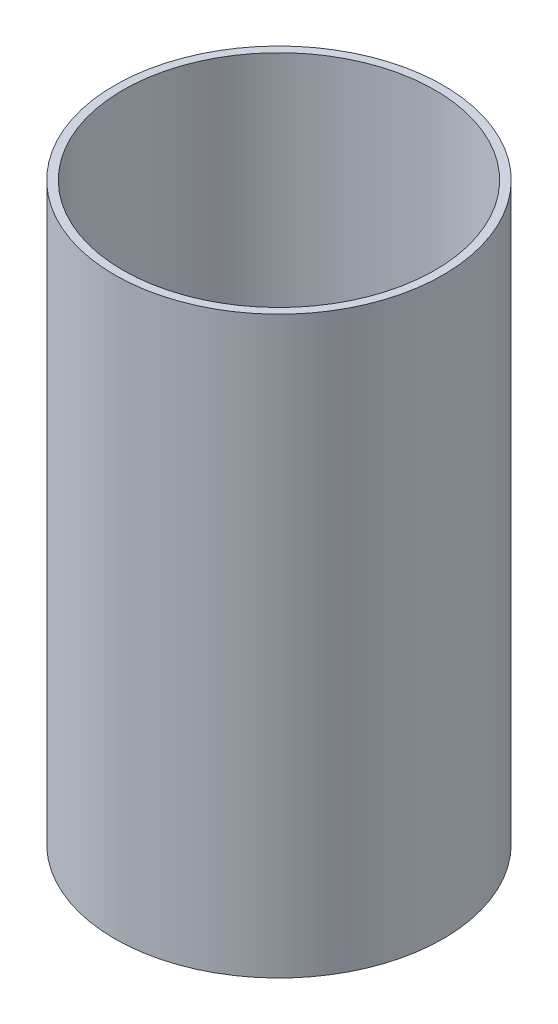
ISO-10303-21;
HEADER;
FILE_DESCRIPTION(('STEP AP214'),'2;1');
FILE_NAME('part.step','',(''),(''),'','','');
FILE_SCHEMA(('AUTOMOTIVE_DESIGN { 1 0 10303 214 1 1 1 1 }'));
ENDSEC;
DATA;
#1=APPLICATION_CONTEXT('core data for automotive mechanical design processes');
#2=APPLICATION_PROTOCOL_DEFINITION('international standard','automotive_design',2000,#1);
#3=PRODUCT_CONTEXT('',#1,'mechanical');
#4=PRODUCT('Part','Part','',(#3));
#5=PRODUCT_RELATED_PRODUCT_CATEGORY('part','',(#4));
#6=PRODUCT_DEFINITION_FORMATION('','',#4);
#7=PRODUCT_DEFINITION_CONTEXT('part definition',#1,'design');
#8=PRODUCT_DEFINITION('design','',#6,#7);
#9=PRODUCT_DEFINITION_SHAPE('','',#8);
#10=(LENGTH_UNIT() NAMED_UNIT(*) SI_UNIT(.MILLI.,.METRE.));
#11=(NAMED_UNIT(*) PLANE_ANGLE_UNIT() SI_UNIT($,.RADIAN.));
#12=(NAMED_UNIT(*) SI_UNIT($,.STERADIAN.) SOLID_ANGLE_UNIT());
#13=UNCERTAINTY_MEASURE_WITH_UNIT(LENGTH_MEASURE(1.E-05),#10,'distance_accuracy_value','');
#14=(GEOMETRIC_REPRESENTATION_CONTEXT(3) GLOBAL_UNCERTAINTY_ASSIGNED_CONTEXT((#13)) GLOBAL_UNIT_ASSIGNED_CONTEXT((#10,
#11,#12)) REPRESENTATION_CONTEXT('',''));
#15=CARTESIAN_POINT('',(0.,0.,0.));
#16=DIRECTION('',(0.,0.,1.));
#17=DIRECTION('',(1.,0.,0.));
#18=AXIS2_PLACEMENT_3D('',#15,#16,#17);
#19=CARTESIAN_POINT('',(0.,177.8,0.));
#20=DIRECTION('',(0.,1.,0.));
#21=DIRECTION('',(0.,0.,1.));
#22=AXIS2_PLACEMENT_3D('',#19,#20,#21);
#23=PLANE('',#22);
#24=CARTESIAN_POINT('',(0.,177.8,0.));
#25=DIRECTION('',(0.,1.,0.));
#26=DIRECTION('',(0.,0.,1.));
#27=AXIS2_PLACEMENT_3D('',#24,#25,#26);
#28=CIRCLE('',#27,50.8);
#29=CARTESIAN_POINT('',(0.,177.8,50.8));
#30=VERTEX_POINT('',#29);
#31=EDGE_CURVE('E10',#30,#30,#28,.T.);
#32=ORIENTED_EDGE('',*,*,#31,.T.);
#33=EDGE_LOOP('',(#32));
#34=FACE_BOUND('',#33,.T.);
#35=CARTESIAN_POINT('',(0.,177.8,0.));
#36=DIRECTION('',(0.,1.,0.));
#37=DIRECTION('',(0.,0.,1.));
#38=AXIS2_PLACEMENT_3D('',#35,#36,#37);
#39=CIRCLE('',#38,48.26);
#40=CARTESIAN_POINT('',(0.,177.8,48.26));
#41=VERTEX_POINT('',#40);
#42=EDGE_CURVE('E50',#41,#41,#39,.T.);
#43=ORIENTED_EDGE('',*,*,#42,.F.);
#44=EDGE_LOOP('',(#43));
#45=FACE_BOUND('',#44,.T.);
#46=ADVANCED_FACE('F37',(#34,#45),#23,.T.);
#47=CARTESIAN_POINT('',(0.,0.,0.));
#48=DIRECTION('',(0.,1.,0.));
#49=DIRECTION('',(0.,0.,1.));
#50=AXIS2_PLACEMENT_3D('',#47,#48,#49);
#51=PLANE('',#50);
#52=CARTESIAN_POINT('',(0.,0.,0.));
#53=DIRECTION('',(0.,1.,0.));
#54=DIRECTION('',(0.,0.,1.));
#55=AXIS2_PLACEMENT_3D('',#52,#53,#54);
#56=CIRCLE('',#55,50.8);
#57=CARTESIAN_POINT('',(0.,0.,50.8));
#58=VERTEX_POINT('',#57);
#59=EDGE_CURVE('E41',#58,#58,#56,.T.);
#60=ORIENTED_EDGE('',*,*,#59,.F.);
#61=EDGE_LOOP('',(#60));
#62=FACE_BOUND('',#61,.T.);
#63=CARTESIAN_POINT('',(0.,0.,0.));
#64=DIRECTION('',(0.,1.,0.));
#65=DIRECTION('',(0.,0.,1.));
#66=AXIS2_PLACEMENT_3D('',#63,#64,#65);
#67=CIRCLE('',#66,48.26);
#68=CARTESIAN_POINT('',(0.,0.,48.26));
#69=VERTEX_POINT('',#68);
#70=EDGE_CURVE('E52',#69,#69,#67,.T.);
#71=ORIENTED_EDGE('',*,*,#70,.T.);
#72=EDGE_LOOP('',(#71));
#73=FACE_BOUND('',#72,.T.);
#74=ADVANCED_FACE('F64',(#62,#73),#51,.F.);
#75=CARTESIAN_POINT('',(0.,177.8,0.));
#76=DIRECTION('',(0.,-1.,0.));
#77=DIRECTION('',(0.,0.,-1.));
#78=AXIS2_PLACEMENT_3D('',#75,#76,#77);
#79=CYLINDRICAL_SURFACE('',#78,50.8);
#80=ORIENTED_EDGE('',*,*,#31,.F.);
#81=EDGE_LOOP('',(#80));
#82=FACE_BOUND('',#81,.T.);
#83=ORIENTED_EDGE('',*,*,#59,.T.);
#84=EDGE_LOOP('',(#83));
#85=FACE_BOUND('',#84,.T.);
#86=ADVANCED_FACE('F39',(#82,#85),#79,.T.);
#87=CARTESIAN_POINT('',(0.,177.8,0.));
#88=DIRECTION('',(0.,-1.,0.));
#89=DIRECTION('',(0.,0.,-1.));
#90=AXIS2_PLACEMENT_3D('',#87,#88,#89);
#91=CYLINDRICAL_SURFACE('',#90,48.26);
#92=ORIENTED_EDGE('',*,*,#42,.T.);
#93=EDGE_LOOP('',(#92));
#94=FACE_BOUND('',#93,.T.);
#95=ORIENTED_EDGE('',*,*,#70,.F.);
#96=EDGE_LOOP('',(#95));
#97=FACE_BOUND('',#96,.T.);
#98=ADVANCED_FACE('F60',(#94,#97),#91,.F.);
#99=CLOSED_SHELL('',(#46,#74,#86,#98));
#100=MANIFOLD_SOLID_BREP('B2',#99);
#101=ADVANCED_BREP_SHAPE_REPRESENTATION('',(#18,#100),#14);
#102=SHAPE_DEFINITION_REPRESENTATION(#9,#101);
ENDSEC;
END-ISO-10303-21;
